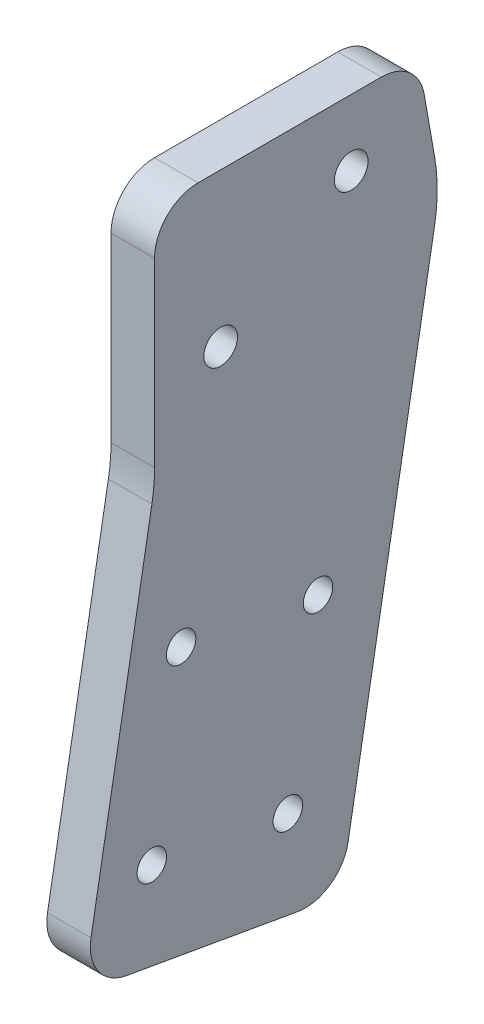
ISO-10303-21;
HEADER;
FILE_DESCRIPTION(('STEP AP214'),'2;1');
FILE_NAME('part.step','',(''),(''),'','','');
FILE_SCHEMA(('AUTOMOTIVE_DESIGN { 1 0 10303 214 1 1 1 1 }'));
ENDSEC;
DATA;
#1=APPLICATION_CONTEXT('core data for automotive mechanical design processes');
#2=APPLICATION_PROTOCOL_DEFINITION('international standard','automotive_design',2000,#1);
#3=PRODUCT_CONTEXT('',#1,'mechanical');
#4=PRODUCT('Part','Part','',(#3));
#5=PRODUCT_RELATED_PRODUCT_CATEGORY('part','',(#4));
#6=PRODUCT_DEFINITION_FORMATION('','',#4);
#7=PRODUCT_DEFINITION_CONTEXT('part definition',#1,'design');
#8=PRODUCT_DEFINITION('design','',#6,#7);
#9=PRODUCT_DEFINITION_SHAPE('','',#8);
#10=(LENGTH_UNIT() NAMED_UNIT(*) SI_UNIT(.MILLI.,.METRE.));
#11=(NAMED_UNIT(*) PLANE_ANGLE_UNIT() SI_UNIT($,.RADIAN.));
#12=(NAMED_UNIT(*) SI_UNIT($,.STERADIAN.) SOLID_ANGLE_UNIT());
#13=UNCERTAINTY_MEASURE_WITH_UNIT(LENGTH_MEASURE(1.E-05),#10,'distance_accuracy_value','');
#14=(GEOMETRIC_REPRESENTATION_CONTEXT(3) GLOBAL_UNCERTAINTY_ASSIGNED_CONTEXT((#13)) GLOBAL_UNIT_ASSIGNED_CONTEXT((#10,
#11,#12)) REPRESENTATION_CONTEXT('',''));
#15=CARTESIAN_POINT('',(0.,0.,0.));
#16=DIRECTION('',(0.,0.,1.));
#17=DIRECTION('',(1.,0.,0.));
#18=AXIS2_PLACEMENT_3D('',#15,#16,#17);
#19=CARTESIAN_POINT('',(-1.31417203510226,230.070458845019,-147.775624550014));
#20=DIRECTION('',(0.,0.984807753012208,-0.17364817766693));
#21=DIRECTION('',(0.,0.17364817766693,0.984807753012208));
#22=AXIS2_PLACEMENT_3D('',#19,#20,#21);
#23=PLANE('',#22);
#24=DIRECTION('',(0.,0.17364817766693,0.984807753012208));
#25=VECTOR('',#24,1.);
#26=CARTESIAN_POINT('',(5.03582796489774,230.070458845019,-147.775624550014));
#27=LINE('',#26,#25);
#28=CARTESIAN_POINT('',(5.03582796489774,231.173124773204,-141.522095318387));
#29=VERTEX_POINT('',#28);
#30=CARTESIAN_POINT('',(5.03582796489774,235.583788485944,-116.507978391878));
#31=VERTEX_POINT('',#30);
#32=EDGE_CURVE('E156',#29,#31,#27,.T.);
#33=ORIENTED_EDGE('',*,*,#32,.T.);
#34=DIRECTION('',(1.,0.,0.));
#35=VECTOR('',#34,1.);
#36=CARTESIAN_POINT('',(-1.31417203510226,235.583788485944,-116.507978391878));
#37=LINE('',#36,#35);
#38=CARTESIAN_POINT('',(-1.31417203510226,235.583788485944,-116.507978391878));
#39=VERTEX_POINT('',#38);
#40=EDGE_CURVE('E190',#31,#39,#37,.F.);
#41=ORIENTED_EDGE('',*,*,#40,.T.);
#42=DIRECTION('',(0.,0.17364817766693,0.984807753012208));
#43=VECTOR('',#42,1.);
#44=CARTESIAN_POINT('',(-1.31417203510226,230.070458845019,-147.775624550014));
#45=LINE('',#44,#43);
#46=CARTESIAN_POINT('',(-1.31417203510226,231.173124773204,-141.522095318387));
#47=VERTEX_POINT('',#46);
#48=EDGE_CURVE('E163',#47,#39,#45,.T.);
#49=ORIENTED_EDGE('',*,*,#48,.F.);
#50=DIRECTION('',(1.,0.,0.));
#51=VECTOR('',#50,1.);
#52=CARTESIAN_POINT('',(-1.31417203510226,231.173124773204,-141.522095318387));
#53=LINE('',#52,#51);
#54=EDGE_CURVE('E187',#47,#29,#53,.T.);
#55=ORIENTED_EDGE('',*,*,#54,.T.);
#56=EDGE_LOOP('',(#33,#41,#49,#55));
#57=FACE_BOUND('',#56,.T.);
#58=ADVANCED_FACE('F36',(#57),#23,.F.);
#59=CARTESIAN_POINT('',(-1.31417203510226,236.686454414129,-110.25444916025));
#60=DIRECTION('',(0.,-0.173648177666931,-0.984807753012208));
#61=DIRECTION('',(0.,0.984807753012208,-0.173648177666931));
#62=AXIS2_PLACEMENT_3D('',#59,#60,#61);
#63=PLANE('',#62);
#64=DIRECTION('',(0.,0.984807753012208,-0.173648177666931));
#65=VECTOR('',#64,1.);
#66=CARTESIAN_POINT('',(-1.31417203510226,236.686454414129,-110.25444916025));
#67=LINE('',#66,#65);
#68=CARTESIAN_POINT('',(-1.31417203510227,242.939983645756,-111.357115088435));
#69=VERTEX_POINT('',#68);
#70=CARTESIAN_POINT('',(-1.31417203510228,293.322725273824,-120.240951799527));
#71=VERTEX_POINT('',#70);
#72=EDGE_CURVE('E243',#69,#71,#67,.T.);
#73=ORIENTED_EDGE('',*,*,#72,.F.);
#74=DIRECTION('',(1.,0.,0.));
#75=VECTOR('',#74,1.);
#76=CARTESIAN_POINT('',(-1.31417203510227,242.939983645756,-111.357115088435));
#77=LINE('',#76,#75);
#78=CARTESIAN_POINT('',(5.03582796489773,242.939983645756,-111.357115088435));
#79=VERTEX_POINT('',#78);
#80=EDGE_CURVE('E177',#69,#79,#77,.T.);
#81=ORIENTED_EDGE('',*,*,#80,.T.);
#82=DIRECTION('',(0.,0.984807753012208,-0.173648177666931));
#83=VECTOR('',#82,1.);
#84=CARTESIAN_POINT('',(5.03582796489774,236.686454414129,-110.25444916025));
#85=LINE('',#84,#83);
#86=CARTESIAN_POINT('',(5.03582796489771,293.322725273824,-120.240951799527));
#87=VERTEX_POINT('',#86);
#88=EDGE_CURVE('E152',#79,#87,#85,.T.);
#89=ORIENTED_EDGE('',*,*,#88,.T.);
#90=DIRECTION('',(1.,0.,0.));
#91=VECTOR('',#90,1.);
#92=CARTESIAN_POINT('',(-1.31417203510228,293.322725273824,-120.240951799527));
#93=LINE('',#92,#91);
#94=EDGE_CURVE('E132',#87,#71,#93,.F.);
#95=ORIENTED_EDGE('',*,*,#94,.T.);
#96=EDGE_LOOP('',(#73,#81,#89,#95));
#97=FACE_BOUND('',#96,.T.);
#98=ADVANCED_FACE('F251',(#97),#63,.F.);
#99=CARTESIAN_POINT('',(-1.3141720351023,330.559017517181,-120.626834873017));
#100=DIRECTION('',(0.,0.,-1.));
#101=DIRECTION('',(-1.,0.,0.));
#102=AXIS2_PLACEMENT_3D('',#99,#100,#101);
#103=PLANE('',#102);
#104=DIRECTION('',(0.,1.,0.));
#105=VECTOR('',#104,1.);
#106=CARTESIAN_POINT('',(5.0358279648977,330.559017517181,-120.626834873017));
#107=LINE('',#106,#105);
#108=CARTESIAN_POINT('',(5.03582796489771,297.733388986564,-120.626834873017));
#109=VERTEX_POINT('',#108);
#110=CARTESIAN_POINT('',(5.0358279648977,324.209017517181,-120.626834873017));
#111=VERTEX_POINT('',#110);
#112=EDGE_CURVE('E143',#109,#111,#107,.T.);
#113=ORIENTED_EDGE('',*,*,#112,.T.);
#114=DIRECTION('',(1.,0.,0.));
#115=VECTOR('',#114,1.);
#116=CARTESIAN_POINT('',(-1.3141720351023,324.209017517181,-120.626834873017));
#117=LINE('',#116,#115);
#118=CARTESIAN_POINT('',(-1.3141720351023,324.209017517181,-120.626834873017));
#119=VERTEX_POINT('',#118);
#120=EDGE_CURVE('E11',#111,#119,#117,.F.);
#121=ORIENTED_EDGE('',*,*,#120,.T.);
#122=DIRECTION('',(0.,1.,0.));
#123=VECTOR('',#122,1.);
#124=CARTESIAN_POINT('',(-1.3141720351023,330.559017517181,-120.626834873017));
#125=LINE('',#124,#123);
#126=CARTESIAN_POINT('',(-1.31417203510229,297.733388986564,-120.626834873017));
#127=VERTEX_POINT('',#126);
#128=EDGE_CURVE('E145',#127,#119,#125,.T.);
#129=ORIENTED_EDGE('',*,*,#128,.F.);
#130=DIRECTION('',(1.,0.,0.));
#131=VECTOR('',#130,1.);
#132=CARTESIAN_POINT('',(5.03582796489771,297.733388986564,-120.626834873017));
#133=LINE('',#132,#131);
#134=EDGE_CURVE('E130',#127,#109,#133,.T.);
#135=ORIENTED_EDGE('',*,*,#134,.T.);
#136=EDGE_LOOP('',(#113,#121,#129,#135));
#137=FACE_BOUND('',#136,.T.);
#138=ADVANCED_FACE('F142',(#137),#103,.F.);
#139=CARTESIAN_POINT('',(-1.3141720351023,330.559017517181,-159.045133050029));
#140=DIRECTION('',(0.,-1.,0.));
#141=DIRECTION('',(1.,0.,0.));
#142=AXIS2_PLACEMENT_3D('',#139,#140,#141);
#143=PLANE('',#142);
#144=DIRECTION('',(0.,0.,-1.));
#145=VECTOR('',#144,1.);
#146=CARTESIAN_POINT('',(5.0358279648977,330.559017517181,-159.045133050029));
#147=LINE('',#146,#145);
#148=CARTESIAN_POINT('',(5.0358279648977,330.559017517181,-126.976834873017));
#149=VERTEX_POINT('',#148);
#150=CARTESIAN_POINT('',(5.0358279648977,330.559017517181,-153.716850392054));
#151=VERTEX_POINT('',#150);
#152=EDGE_CURVE('E151',#149,#151,#147,.T.);
#153=ORIENTED_EDGE('',*,*,#152,.T.);
#154=DIRECTION('',(1.,0.,0.));
#155=VECTOR('',#154,1.);
#156=CARTESIAN_POINT('',(-1.3141720351023,330.559017517181,-153.716850392054));
#157=LINE('',#156,#155);
#158=CARTESIAN_POINT('',(-1.3141720351023,330.559017517181,-153.716850392054));
#159=VERTEX_POINT('',#158);
#160=EDGE_CURVE('E44',#151,#159,#157,.F.);
#161=ORIENTED_EDGE('',*,*,#160,.T.);
#162=DIRECTION('',(0.,0.,-1.));
#163=VECTOR('',#162,1.);
#164=CARTESIAN_POINT('',(-1.3141720351023,330.559017517181,-159.045133050029));
#165=LINE('',#164,#163);
#166=CARTESIAN_POINT('',(-1.3141720351023,330.559017517181,-126.976834873017));
#167=VERTEX_POINT('',#166);
#168=EDGE_CURVE('E208',#167,#159,#165,.T.);
#169=ORIENTED_EDGE('',*,*,#168,.F.);
#170=DIRECTION('',(1.,0.,0.));
#171=VECTOR('',#170,1.);
#172=CARTESIAN_POINT('',(-1.3141720351023,330.559017517181,-126.976834873017));
#173=LINE('',#172,#171);
#174=EDGE_CURVE('E204',#167,#149,#173,.T.);
#175=ORIENTED_EDGE('',*,*,#174,.T.);
#176=EDGE_LOOP('',(#153,#161,#169,#175));
#177=FACE_BOUND('',#176,.T.);
#178=ADVANCED_FACE('F207',(#177),#143,.F.);
#179=CARTESIAN_POINT('',(-1.31417203510229,312.271017517181,-162.269800873226));
#180=DIRECTION('',(0.,-0.173648177666927,0.984807753012209));
#181=DIRECTION('',(0.,-0.984807753012209,-0.173648177666927));
#182=AXIS2_PLACEMENT_3D('',#179,#180,#181);
#183=PLANE('',#182);
#184=DIRECTION('',(0.,-0.984807753012209,-0.173648177666927));
#185=VECTOR('',#184,1.);
#186=CARTESIAN_POINT('',(-1.31417203510229,312.271017517181,-162.269800873226));
#187=LINE('',#186,#185);
#188=CARTESIAN_POINT('',(-1.3141720351023,325.311683445366,-159.970379623681));
#189=VERTEX_POINT('',#188);
#190=CARTESIAN_POINT('',(-1.3141720351023,316.681681229921,-161.492081857838));
#191=VERTEX_POINT('',#190);
#192=EDGE_CURVE('E218',#189,#191,#187,.T.);
#193=ORIENTED_EDGE('',*,*,#192,.F.);
#194=DIRECTION('',(1.,0.,0.));
#195=VECTOR('',#194,1.);
#196=CARTESIAN_POINT('',(-1.3141720351023,325.311683445366,-159.970379623681));
#197=LINE('',#196,#195);
#198=CARTESIAN_POINT('',(5.0358279648977,325.311683445366,-159.970379623681));
#199=VERTEX_POINT('',#198);
#200=EDGE_CURVE('E201',#189,#199,#197,.T.);
#201=ORIENTED_EDGE('',*,*,#200,.T.);
#202=DIRECTION('',(0.,-0.984807753012209,-0.173648177666927));
#203=VECTOR('',#202,1.);
#204=CARTESIAN_POINT('',(5.03582796489771,312.271017517181,-162.269800873226));
#205=LINE('',#204,#203);
#206=CARTESIAN_POINT('',(5.0358279648977,316.681681229921,-161.492081857838));
#207=VERTEX_POINT('',#206);
#208=EDGE_CURVE('E154',#199,#207,#205,.T.);
#209=ORIENTED_EDGE('',*,*,#208,.T.);
#210=DIRECTION('',(1.,0.,0.));
#211=VECTOR('',#210,1.);
#212=CARTESIAN_POINT('',(-1.3141720351023,316.681681229921,-161.492081857838));
#213=LINE('',#212,#211);
#214=EDGE_CURVE('E172',#207,#191,#213,.F.);
#215=ORIENTED_EDGE('',*,*,#214,.T.);
#216=EDGE_LOOP('',(#193,#201,#209,#215));
#217=FACE_BOUND('',#216,.T.);
#218=ADVANCED_FACE('F217',(#217),#183,.F.);
#219=CARTESIAN_POINT('',(-1.31417203510226,230.070458845019,-147.775624550014));
#220=DIRECTION('',(0.,0.173648177666931,0.984807753012208));
#221=DIRECTION('',(0.,-0.984807753012208,0.173648177666931));
#222=AXIS2_PLACEMENT_3D('',#219,#220,#221);
#223=PLANE('',#222);
#224=DIRECTION('',(0.,-0.984807753012208,0.173648177666931));
#225=VECTOR('',#224,1.);
#226=CARTESIAN_POINT('',(5.03582796489774,230.070458845019,-147.775624550014));
#227=LINE('',#226,#225);
#228=CARTESIAN_POINT('',(5.03582796489771,307.860353804441,-161.492081857838));
#229=VERTEX_POINT('',#228);
#230=CARTESIAN_POINT('',(5.03582796489773,236.323988076647,-148.878290478199));
#231=VERTEX_POINT('',#230);
#232=EDGE_CURVE('E161',#229,#231,#227,.T.);
#233=ORIENTED_EDGE('',*,*,#232,.T.);
#234=DIRECTION('',(1.,0.,0.));
#235=VECTOR('',#234,1.);
#236=CARTESIAN_POINT('',(-1.31417203510227,236.323988076647,-148.878290478199));
#237=LINE('',#236,#235);
#238=CARTESIAN_POINT('',(-1.31417203510227,236.323988076647,-148.878290478199));
#239=VERTEX_POINT('',#238);
#240=EDGE_CURVE('E199',#231,#239,#237,.F.);
#241=ORIENTED_EDGE('',*,*,#240,.T.);
#242=DIRECTION('',(0.,-0.984807753012208,0.173648177666931));
#243=VECTOR('',#242,1.);
#244=CARTESIAN_POINT('',(-1.31417203510226,230.070458845019,-147.775624550014));
#245=LINE('',#244,#243);
#246=CARTESIAN_POINT('',(-1.31417203510229,307.860353804441,-161.492081857838));
#247=VERTEX_POINT('',#246);
#248=EDGE_CURVE('E146',#247,#239,#245,.T.);
#249=ORIENTED_EDGE('',*,*,#248,.F.);
#250=DIRECTION('',(1.,0.,0.));
#251=VECTOR('',#250,1.);
#252=CARTESIAN_POINT('',(-1.31417203510229,307.860353804441,-161.492081857838));
#253=LINE('',#252,#251);
#254=EDGE_CURVE('E166',#247,#229,#253,.T.);
#255=ORIENTED_EDGE('',*,*,#254,.T.);
#256=EDGE_LOOP('',(#233,#241,#249,#255));
#257=FACE_BOUND('',#256,.T.);
#258=ADVANCED_FACE('F286',(#257),#223,.F.);
#259=CARTESIAN_POINT('',(-1.31417203510217,0.,0.));
#260=DIRECTION('',(-1.,0.,0.));
#261=DIRECTION('',(0.,-1.,0.));
#262=AXIS2_PLACEMENT_3D('',#259,#260,#261);
#263=PLANE('',#262);
#264=CARTESIAN_POINT('',(-1.3141720351023,320.907017517181,-149.328834873017));
#265=DIRECTION('',(-1.,0.,0.));
#266=DIRECTION('',(0.,0.,1.));
#267=AXIS2_PLACEMENT_3D('',#264,#265,#266);
#268=CIRCLE('',#267,4.21640000000001);
#269=CARTESIAN_POINT('',(-1.3141720351023,320.907017517181,-145.112434873017));
#270=VERTEX_POINT('',#269);
#271=EDGE_CURVE('E570',#270,#270,#268,.T.);
#272=ORIENTED_EDGE('',*,*,#271,.F.);
#273=EDGE_LOOP('',(#272));
#274=FACE_BOUND('',#273,.T.);
#275=CARTESIAN_POINT('',(-1.31417203510229,308.207017517181,-130.278834873017));
#276=DIRECTION('',(-1.,0.,0.));
#277=DIRECTION('',(0.,0.,1.));
#278=AXIS2_PLACEMENT_3D('',#275,#276,#277);
#279=CIRCLE('',#278,4.21640000000001);
#280=CARTESIAN_POINT('',(-1.31417203510229,308.207017517181,-126.062434873017));
#281=VERTEX_POINT('',#280);
#282=EDGE_CURVE('E561',#281,#281,#279,.T.);
#283=ORIENTED_EDGE('',*,*,#282,.F.);
#284=EDGE_LOOP('',(#283));
#285=FACE_BOUND('',#284,.T.);
#286=CARTESIAN_POINT('',(-1.31417203510228,273.13941545584,-124.504125042983));
#287=DIRECTION('',(-1.,0.,0.));
#288=DIRECTION('',(0.,0.,1.));
#289=AXIS2_PLACEMENT_3D('',#286,#287,#288);
#290=CIRCLE('',#289,3.54329999999997);
#291=CARTESIAN_POINT('',(-1.31417203510228,273.13941545584,-120.960825042983));
#292=VERTEX_POINT('',#291);
#293=EDGE_CURVE('E552',#292,#292,#290,.T.);
#294=ORIENTED_EDGE('',*,*,#293,.F.);
#295=EDGE_LOOP('',(#294));
#296=FACE_BOUND('',#295,.T.);
#297=CARTESIAN_POINT('',(-1.31417203510228,269.72417914843,-144.485224024571));
#298=DIRECTION('',(-1.,0.,0.));
#299=DIRECTION('',(0.,0.,1.));
#300=AXIS2_PLACEMENT_3D('',#297,#298,#299);
#301=CIRCLE('',#300,3.54329999999997);
#302=CARTESIAN_POINT('',(-1.31417203510228,269.72417914843,-140.941924024571));
#303=VERTEX_POINT('',#302);
#304=EDGE_CURVE('E543',#303,#303,#301,.T.);
#305=ORIENTED_EDGE('',*,*,#304,.F.);
#306=EDGE_LOOP('',(#305));
#307=FACE_BOUND('',#306,.T.);
#308=CARTESIAN_POINT('',(-1.31417203510227,244.32417914843,-140.075144867288));
#309=DIRECTION('',(-1.,0.,0.));
#310=DIRECTION('',(0.,0.,1.));
#311=AXIS2_PLACEMENT_3D('',#308,#309,#310);
#312=CIRCLE('',#311,3.5433);
#313=CARTESIAN_POINT('',(-1.31417203510227,244.32417914843,-136.531844867288));
#314=VERTEX_POINT('',#313);
#315=EDGE_CURVE('E534',#314,#314,#312,.T.);
#316=ORIENTED_EDGE('',*,*,#315,.F.);
#317=EDGE_LOOP('',(#316));
#318=FACE_BOUND('',#317,.T.);
#319=CARTESIAN_POINT('',(-1.31417203510227,247.716621745922,-120.227402213944));
#320=DIRECTION('',(-1.,0.,0.));
#321=DIRECTION('',(0.,0.,1.));
#322=AXIS2_PLACEMENT_3D('',#319,#320,#321);
#323=CIRCLE('',#322,3.54330000000003);
#324=CARTESIAN_POINT('',(-1.31417203510227,247.716621745922,-116.684102213944));
#325=VERTEX_POINT('',#324);
#326=EDGE_CURVE('E237',#325,#325,#323,.T.);
#327=ORIENTED_EDGE('',*,*,#326,.F.);
#328=EDGE_LOOP('',(#327));
#329=FACE_BOUND('',#328,.T.);
#330=ORIENTED_EDGE('',*,*,#48,.T.);
#331=CARTESIAN_POINT('',(-1.31417203510227,241.837317717571,-117.610644320063));
#332=DIRECTION('',(-1.,0.,0.));
#333=DIRECTION('',(0.,-1.,0.));
#334=AXIS2_PLACEMENT_3D('',#331,#332,#333);
#335=CIRCLE('',#334,6.35);
#336=EDGE_CURVE('E197',#39,#69,#335,.T.);
#337=ORIENTED_EDGE('',*,*,#336,.T.);
#338=ORIENTED_EDGE('',*,*,#72,.T.);
#339=CARTESIAN_POINT('',(-1.31417203510229,297.733388986564,-95.2268348730171));
#340=DIRECTION('',(-1.,0.,0.));
#341=DIRECTION('',(0.,-1.,0.));
#342=AXIS2_PLACEMENT_3D('',#339,#340,#341);
#343=CIRCLE('',#342,25.4);
#344=EDGE_CURVE('E136',#71,#127,#343,.F.);
#345=ORIENTED_EDGE('',*,*,#344,.T.);
#346=ORIENTED_EDGE('',*,*,#128,.T.);
#347=CARTESIAN_POINT('',(-1.3141720351023,324.209017517181,-126.976834873017));
#348=DIRECTION('',(-1.,0.,0.));
#349=DIRECTION('',(0.,-1.,0.));
#350=AXIS2_PLACEMENT_3D('',#347,#348,#349);
#351=CIRCLE('',#350,6.35);
#352=EDGE_CURVE('E57',#119,#167,#351,.T.);
#353=ORIENTED_EDGE('',*,*,#352,.T.);
#354=ORIENTED_EDGE('',*,*,#168,.T.);
#355=CARTESIAN_POINT('',(-1.3141720351023,324.209017517181,-153.716850392054));
#356=DIRECTION('',(-1.,0.,0.));
#357=DIRECTION('',(0.,-1.,0.));
#358=AXIS2_PLACEMENT_3D('',#355,#356,#357);
#359=CIRCLE('',#358,6.35);
#360=EDGE_CURVE('E193',#159,#189,#359,.T.);
#361=ORIENTED_EDGE('',*,*,#360,.T.);
#362=ORIENTED_EDGE('',*,*,#192,.T.);
#363=CARTESIAN_POINT('',(-1.31417203510229,312.271017517181,-136.477964931328));
#364=DIRECTION('',(-1.,0.,0.));
#365=DIRECTION('',(0.,-1.,0.));
#366=AXIS2_PLACEMENT_3D('',#363,#364,#365);
#367=CIRCLE('',#366,25.4);
#368=EDGE_CURVE('E137',#191,#247,#367,.T.);
#369=ORIENTED_EDGE('',*,*,#368,.T.);
#370=ORIENTED_EDGE('',*,*,#248,.T.);
#371=CARTESIAN_POINT('',(-1.31417203510227,237.426654004832,-142.624761246572));
#372=DIRECTION('',(-1.,0.,0.));
#373=DIRECTION('',(0.,-1.,0.));
#374=AXIS2_PLACEMENT_3D('',#371,#372,#373);
#375=CIRCLE('',#374,6.35);
#376=EDGE_CURVE('E195',#239,#47,#375,.T.);
#377=ORIENTED_EDGE('',*,*,#376,.T.);
#378=EDGE_LOOP('',(#330,#337,#338,#345,#346,#353,#354,#361,#362,#369,#370,#377));
#379=FACE_BOUND('',#378,.T.);
#380=ADVANCED_FACE('F244',(#274,#285,#296,#307,#318,#329,#379),#263,.T.);
#381=CARTESIAN_POINT('',(5.03582796489783,0.,0.));
#382=DIRECTION('',(-1.,0.,0.));
#383=DIRECTION('',(0.,-1.,0.));
#384=AXIS2_PLACEMENT_3D('',#381,#382,#383);
#385=PLANE('',#384);
#386=CARTESIAN_POINT('',(5.03582796489777,320.907017517181,-149.328834873017));
#387=DIRECTION('',(-1.,0.,0.));
#388=DIRECTION('',(0.,0.,1.));
#389=AXIS2_PLACEMENT_3D('',#386,#387,#388);
#390=CIRCLE('',#389,2.45744999999997);
#391=CARTESIAN_POINT('',(5.03582796489777,320.907017517181,-146.871384873017));
#392=VERTEX_POINT('',#391);
#393=EDGE_CURVE('E564',#392,#392,#390,.T.);
#394=ORIENTED_EDGE('',*,*,#393,.T.);
#395=EDGE_LOOP('',(#394));
#396=FACE_BOUND('',#395,.T.);
#397=CARTESIAN_POINT('',(5.03582796489778,308.207017517181,-130.278834873017));
#398=DIRECTION('',(-1.,0.,0.));
#399=DIRECTION('',(0.,0.,1.));
#400=AXIS2_PLACEMENT_3D('',#397,#398,#399);
#401=CIRCLE('',#400,2.45744999999997);
#402=CARTESIAN_POINT('',(5.03582796489778,308.207017517181,-127.821384873017));
#403=VERTEX_POINT('',#402);
#404=EDGE_CURVE('E555',#403,#403,#401,.T.);
#405=ORIENTED_EDGE('',*,*,#404,.T.);
#406=EDGE_LOOP('',(#405));
#407=FACE_BOUND('',#406,.T.);
#408=CARTESIAN_POINT('',(5.03582796489776,273.13941545584,-124.504125042983));
#409=DIRECTION('',(-1.,0.,0.));
#410=DIRECTION('',(0.,0.,1.));
#411=AXIS2_PLACEMENT_3D('',#408,#409,#410);
#412=CIRCLE('',#411,2.15264999999998);
#413=CARTESIAN_POINT('',(5.03582796489776,273.13941545584,-122.351475042983));
#414=VERTEX_POINT('',#413);
#415=EDGE_CURVE('E546',#414,#414,#412,.T.);
#416=ORIENTED_EDGE('',*,*,#415,.T.);
#417=EDGE_LOOP('',(#416));
#418=FACE_BOUND('',#417,.T.);
#419=CARTESIAN_POINT('',(5.03582796489776,269.72417914843,-144.485224024571));
#420=DIRECTION('',(-1.,0.,0.));
#421=DIRECTION('',(0.,0.,1.));
#422=AXIS2_PLACEMENT_3D('',#419,#420,#421);
#423=CIRCLE('',#422,2.15264999999998);
#424=CARTESIAN_POINT('',(5.03582796489776,269.72417914843,-142.332574024571));
#425=VERTEX_POINT('',#424);
#426=EDGE_CURVE('E537',#425,#425,#423,.T.);
#427=ORIENTED_EDGE('',*,*,#426,.T.);
#428=EDGE_LOOP('',(#427));
#429=FACE_BOUND('',#428,.T.);
#430=CARTESIAN_POINT('',(5.03582796489777,244.32417914843,-140.075144867288));
#431=DIRECTION('',(-1.,0.,0.));
#432=DIRECTION('',(0.,0.,1.));
#433=AXIS2_PLACEMENT_3D('',#430,#431,#432);
#434=CIRCLE('',#433,2.15265000000001);
#435=CARTESIAN_POINT('',(5.03582796489777,244.32417914843,-137.922494867288));
#436=VERTEX_POINT('',#435);
#437=EDGE_CURVE('E527',#436,#436,#434,.T.);
#438=ORIENTED_EDGE('',*,*,#437,.T.);
#439=EDGE_LOOP('',(#438));
#440=FACE_BOUND('',#439,.T.);
#441=CARTESIAN_POINT('',(5.03582796489777,247.716621745922,-120.227402213944));
#442=DIRECTION('',(-1.,0.,0.));
#443=DIRECTION('',(0.,0.,1.));
#444=AXIS2_PLACEMENT_3D('',#441,#442,#443);
#445=CIRCLE('',#444,2.15265000000001);
#446=CARTESIAN_POINT('',(5.03582796489777,247.716621745922,-118.074752213944));
#447=VERTEX_POINT('',#446);
#448=EDGE_CURVE('E227',#447,#447,#445,.T.);
#449=ORIENTED_EDGE('',*,*,#448,.T.);
#450=EDGE_LOOP('',(#449));
#451=FACE_BOUND('',#450,.T.);
#452=ORIENTED_EDGE('',*,*,#88,.F.);
#453=CARTESIAN_POINT('',(5.03582796489773,241.837317717571,-117.610644320063));
#454=DIRECTION('',(-1.,0.,0.));
#455=DIRECTION('',(0.,-1.,0.));
#456=AXIS2_PLACEMENT_3D('',#453,#454,#455);
#457=CIRCLE('',#456,6.35);
#458=EDGE_CURVE('E185',#79,#31,#457,.F.);
#459=ORIENTED_EDGE('',*,*,#458,.T.);
#460=ORIENTED_EDGE('',*,*,#32,.F.);
#461=CARTESIAN_POINT('',(5.03582796489773,237.426654004832,-142.624761246572));
#462=DIRECTION('',(-1.,0.,0.));
#463=DIRECTION('',(0.,-1.,0.));
#464=AXIS2_PLACEMENT_3D('',#461,#462,#463);
#465=CIRCLE('',#464,6.35);
#466=EDGE_CURVE('E183',#29,#231,#465,.F.);
#467=ORIENTED_EDGE('',*,*,#466,.T.);
#468=ORIENTED_EDGE('',*,*,#232,.F.);
#469=CARTESIAN_POINT('',(5.03582796489771,312.271017517181,-136.477964931328));
#470=DIRECTION('',(-1.,0.,0.));
#471=DIRECTION('',(0.,-1.,0.));
#472=AXIS2_PLACEMENT_3D('',#469,#470,#471);
#473=CIRCLE('',#472,25.4);
#474=EDGE_CURVE('E169',#229,#207,#473,.F.);
#475=ORIENTED_EDGE('',*,*,#474,.T.);
#476=ORIENTED_EDGE('',*,*,#208,.F.);
#477=CARTESIAN_POINT('',(5.0358279648977,324.209017517181,-153.716850392054));
#478=DIRECTION('',(-1.,0.,0.));
#479=DIRECTION('',(0.,-1.,0.));
#480=AXIS2_PLACEMENT_3D('',#477,#478,#479);
#481=CIRCLE('',#480,6.35);
#482=EDGE_CURVE('E181',#199,#151,#481,.F.);
#483=ORIENTED_EDGE('',*,*,#482,.T.);
#484=ORIENTED_EDGE('',*,*,#152,.F.);
#485=CARTESIAN_POINT('',(5.0358279648977,324.209017517181,-126.976834873017));
#486=DIRECTION('',(-1.,0.,0.));
#487=DIRECTION('',(0.,-1.,0.));
#488=AXIS2_PLACEMENT_3D('',#485,#486,#487);
#489=CIRCLE('',#488,6.35);
#490=EDGE_CURVE('E150',#149,#111,#489,.F.);
#491=ORIENTED_EDGE('',*,*,#490,.T.);
#492=ORIENTED_EDGE('',*,*,#112,.F.);
#493=CARTESIAN_POINT('',(5.03582796489771,297.733388986564,-95.2268348730171));
#494=DIRECTION('',(-1.,0.,0.));
#495=DIRECTION('',(0.,-1.,0.));
#496=AXIS2_PLACEMENT_3D('',#493,#494,#495);
#497=CIRCLE('',#496,25.4);
#498=EDGE_CURVE('E126',#109,#87,#497,.T.);
#499=ORIENTED_EDGE('',*,*,#498,.T.);
#500=EDGE_LOOP('',(#452,#459,#460,#467,#468,#475,#476,#483,#484,#491,#492,#499));
#501=FACE_BOUND('',#500,.T.);
#502=ADVANCED_FACE('F148',(#396,#407,#418,#429,#440,#451,#501),#385,.F.);
#503=CARTESIAN_POINT('',(-1.31417203510228,297.733388986564,-95.2268348730171));
#504=DIRECTION('',(-1.,0.,0.));
#505=DIRECTION('',(0.,-1.,0.));
#506=AXIS2_PLACEMENT_3D('',#503,#504,#505);
#507=CYLINDRICAL_SURFACE('',#506,25.4);
#508=ORIENTED_EDGE('',*,*,#344,.F.);
#509=ORIENTED_EDGE('',*,*,#94,.F.);
#510=ORIENTED_EDGE('',*,*,#498,.F.);
#511=ORIENTED_EDGE('',*,*,#134,.F.);
#512=EDGE_LOOP('',(#508,#509,#510,#511));
#513=FACE_BOUND('',#512,.T.);
#514=ADVANCED_FACE('F129',(#513),#507,.F.);
#515=CARTESIAN_POINT('',(-1.31417203510229,312.271017517181,-136.477964931328));
#516=DIRECTION('',(1.,0.,0.));
#517=DIRECTION('',(0.,1.,0.));
#518=AXIS2_PLACEMENT_3D('',#515,#516,#517);
#519=CYLINDRICAL_SURFACE('',#518,25.4);
#520=ORIENTED_EDGE('',*,*,#368,.F.);
#521=ORIENTED_EDGE('',*,*,#214,.F.);
#522=ORIENTED_EDGE('',*,*,#474,.F.);
#523=ORIENTED_EDGE('',*,*,#254,.F.);
#524=EDGE_LOOP('',(#520,#521,#522,#523));
#525=FACE_BOUND('',#524,.T.);
#526=ADVANCED_FACE('F262',(#525),#519,.T.);
#527=CARTESIAN_POINT('',(-1.31417203510227,247.716621745922,-120.227402213944));
#528=DIRECTION('',(-1.,0.,0.));
#529=DIRECTION('',(0.,0.,1.));
#530=AXIS2_PLACEMENT_3D('',#527,#528,#529);
#531=CYLINDRICAL_SURFACE('',#530,2.15264999999999);
#532=ORIENTED_EDGE('',*,*,#448,.F.);
#533=EDGE_LOOP('',(#532));
#534=FACE_BOUND('',#533,.T.);
#535=CARTESIAN_POINT('',(-0.147278133005591,247.716621745922,-120.227402213944));
#536=DIRECTION('',(-1.,0.,0.));
#537=DIRECTION('',(0.,0.,1.));
#538=AXIS2_PLACEMENT_3D('',#535,#536,#537);
#539=CIRCLE('',#538,2.15264999999998);
#540=CARTESIAN_POINT('',(-0.147278133005591,247.716621745922,-118.074752213944));
#541=VERTEX_POINT('',#540);
#542=EDGE_CURVE('E232',#541,#541,#539,.T.);
#543=ORIENTED_EDGE('',*,*,#542,.T.);
#544=EDGE_LOOP('',(#543));
#545=FACE_BOUND('',#544,.T.);
#546=ADVANCED_FACE('F265',(#534,#545),#531,.F.);
#547=CARTESIAN_POINT('',(-1.31417203510227,247.716621745922,-120.227402213944));
#548=DIRECTION('',(-1.,0.,0.));
#549=DIRECTION('',(0.,0.,1.));
#550=AXIS2_PLACEMENT_3D('',#547,#548,#549);
#551=CONICAL_SURFACE('',#550,3.54330000000003,0.872664625997184);
#552=ORIENTED_EDGE('',*,*,#542,.F.);
#553=EDGE_LOOP('',(#552));
#554=FACE_BOUND('',#553,.T.);
#555=ORIENTED_EDGE('',*,*,#326,.T.);
#556=EDGE_LOOP('',(#555));
#557=FACE_BOUND('',#556,.T.);
#558=ADVANCED_FACE('F425',(#554,#557),#551,.F.);
#559=CARTESIAN_POINT('',(-1.31417203510227,244.32417914843,-140.075144867288));
#560=DIRECTION('',(-1.,0.,0.));
#561=DIRECTION('',(0.,0.,1.));
#562=AXIS2_PLACEMENT_3D('',#559,#560,#561);
#563=CYLINDRICAL_SURFACE('',#562,2.15264999999999);
#564=ORIENTED_EDGE('',*,*,#437,.F.);
#565=EDGE_LOOP('',(#564));
#566=FACE_BOUND('',#565,.T.);
#567=CARTESIAN_POINT('',(-0.147278133005591,244.32417914843,-140.075144867288));
#568=DIRECTION('',(-1.,0.,0.));
#569=DIRECTION('',(0.,0.,1.));
#570=AXIS2_PLACEMENT_3D('',#567,#568,#569);
#571=CIRCLE('',#570,2.15264999999998);
#572=CARTESIAN_POINT('',(-0.147278133005591,244.32417914843,-137.922494867288));
#573=VERTEX_POINT('',#572);
#574=EDGE_CURVE('E529',#573,#573,#571,.T.);
#575=ORIENTED_EDGE('',*,*,#574,.T.);
#576=EDGE_LOOP('',(#575));
#577=FACE_BOUND('',#576,.T.);
#578=ADVANCED_FACE('F418',(#566,#577),#563,.F.);
#579=CARTESIAN_POINT('',(-1.31417203510227,244.32417914843,-140.075144867288));
#580=DIRECTION('',(-1.,0.,0.));
#581=DIRECTION('',(0.,0.,1.));
#582=AXIS2_PLACEMENT_3D('',#579,#580,#581);
#583=CONICAL_SURFACE('',#582,3.5433,0.872664625997175);
#584=ORIENTED_EDGE('',*,*,#574,.F.);
#585=EDGE_LOOP('',(#584));
#586=FACE_BOUND('',#585,.T.);
#587=ORIENTED_EDGE('',*,*,#315,.T.);
#588=EDGE_LOOP('',(#587));
#589=FACE_BOUND('',#588,.T.);
#590=ADVANCED_FACE('F411',(#586,#589),#583,.F.);
#591=CARTESIAN_POINT('',(-1.31417203510228,269.72417914843,-144.485224024571));
#592=DIRECTION('',(-1.,0.,0.));
#593=DIRECTION('',(0.,0.,1.));
#594=AXIS2_PLACEMENT_3D('',#591,#592,#593);
#595=CYLINDRICAL_SURFACE('',#594,2.15264999999998);
#596=ORIENTED_EDGE('',*,*,#426,.F.);
#597=EDGE_LOOP('',(#596));
#598=FACE_BOUND('',#597,.T.);
#599=CARTESIAN_POINT('',(-0.1472781330056,269.72417914843,-144.485224024571));
#600=DIRECTION('',(-1.,0.,0.));
#601=DIRECTION('',(0.,0.,1.));
#602=AXIS2_PLACEMENT_3D('',#599,#600,#601);
#603=CIRCLE('',#602,2.15264999999998);
#604=CARTESIAN_POINT('',(-0.1472781330056,269.72417914843,-142.332574024571));
#605=VERTEX_POINT('',#604);
#606=EDGE_CURVE('E540',#605,#605,#603,.T.);
#607=ORIENTED_EDGE('',*,*,#606,.T.);
#608=EDGE_LOOP('',(#607));
#609=FACE_BOUND('',#608,.T.);
#610=ADVANCED_FACE('F404',(#598,#609),#595,.F.);
#611=CARTESIAN_POINT('',(-1.31417203510228,269.72417914843,-144.485224024571));
#612=DIRECTION('',(-1.,0.,0.));
#613=DIRECTION('',(0.,0.,1.));
#614=AXIS2_PLACEMENT_3D('',#611,#612,#613);
#615=CONICAL_SURFACE('',#614,3.54329999999997,0.872664625997165);
#616=ORIENTED_EDGE('',*,*,#606,.F.);
#617=EDGE_LOOP('',(#616));
#618=FACE_BOUND('',#617,.T.);
#619=ORIENTED_EDGE('',*,*,#304,.T.);
#620=EDGE_LOOP('',(#619));
#621=FACE_BOUND('',#620,.T.);
#622=ADVANCED_FACE('F397',(#618,#621),#615,.F.);
#623=CARTESIAN_POINT('',(-1.31417203510228,273.13941545584,-124.504125042983));
#624=DIRECTION('',(-1.,0.,0.));
#625=DIRECTION('',(0.,0.,1.));
#626=AXIS2_PLACEMENT_3D('',#623,#624,#625);
#627=CYLINDRICAL_SURFACE('',#626,2.15264999999998);
#628=ORIENTED_EDGE('',*,*,#415,.F.);
#629=EDGE_LOOP('',(#628));
#630=FACE_BOUND('',#629,.T.);
#631=CARTESIAN_POINT('',(-0.1472781330056,273.13941545584,-124.504125042983));
#632=DIRECTION('',(-1.,0.,0.));
#633=DIRECTION('',(0.,0.,1.));
#634=AXIS2_PLACEMENT_3D('',#631,#632,#633);
#635=CIRCLE('',#634,2.15264999999998);
#636=CARTESIAN_POINT('',(-0.1472781330056,273.13941545584,-122.351475042983));
#637=VERTEX_POINT('',#636);
#638=EDGE_CURVE('E549',#637,#637,#635,.T.);
#639=ORIENTED_EDGE('',*,*,#638,.T.);
#640=EDGE_LOOP('',(#639));
#641=FACE_BOUND('',#640,.T.);
#642=ADVANCED_FACE('F389',(#630,#641),#627,.F.);
#643=CARTESIAN_POINT('',(-1.31417203510228,273.13941545584,-124.504125042983));
#644=DIRECTION('',(-1.,0.,0.));
#645=DIRECTION('',(0.,0.,1.));
#646=AXIS2_PLACEMENT_3D('',#643,#644,#645);
#647=CONICAL_SURFACE('',#646,3.54329999999997,0.872664625997165);
#648=ORIENTED_EDGE('',*,*,#638,.F.);
#649=EDGE_LOOP('',(#648));
#650=FACE_BOUND('',#649,.T.);
#651=ORIENTED_EDGE('',*,*,#293,.T.);
#652=EDGE_LOOP('',(#651));
#653=FACE_BOUND('',#652,.T.);
#654=ADVANCED_FACE('F383',(#650,#653),#647,.F.);
#655=CARTESIAN_POINT('',(-1.31417203510229,308.207017517181,-130.278834873017));
#656=DIRECTION('',(-1.,0.,0.));
#657=DIRECTION('',(0.,0.,1.));
#658=AXIS2_PLACEMENT_3D('',#655,#656,#657);
#659=CYLINDRICAL_SURFACE('',#658,2.45744999999997);
#660=ORIENTED_EDGE('',*,*,#404,.F.);
#661=EDGE_LOOP('',(#660));
#662=FACE_BOUND('',#661,.T.);
#663=CARTESIAN_POINT('',(0.161762261156988,308.207017517181,-130.278834873017));
#664=DIRECTION('',(-1.,0.,0.));
#665=DIRECTION('',(0.,0.,1.));
#666=AXIS2_PLACEMENT_3D('',#663,#664,#665);
#667=CIRCLE('',#666,2.45744999999997);
#668=CARTESIAN_POINT('',(0.161762261156988,308.207017517181,-127.821384873017));
#669=VERTEX_POINT('',#668);
#670=EDGE_CURVE('E558',#669,#669,#667,.T.);
#671=ORIENTED_EDGE('',*,*,#670,.T.);
#672=EDGE_LOOP('',(#671));
#673=FACE_BOUND('',#672,.T.);
#674=ADVANCED_FACE('F376',(#662,#673),#659,.F.);
#675=CARTESIAN_POINT('',(-1.31417203510229,308.207017517181,-130.278834873017));
#676=DIRECTION('',(-1.,0.,0.));
#677=DIRECTION('',(0.,0.,1.));
#678=AXIS2_PLACEMENT_3D('',#675,#676,#677);
#679=CONICAL_SURFACE('',#678,4.21640000000001,0.872664625997174);
#680=ORIENTED_EDGE('',*,*,#670,.F.);
#681=EDGE_LOOP('',(#680));
#682=FACE_BOUND('',#681,.T.);
#683=ORIENTED_EDGE('',*,*,#282,.T.);
#684=EDGE_LOOP('',(#683));
#685=FACE_BOUND('',#684,.T.);
#686=ADVANCED_FACE('F369',(#682,#685),#679,.F.);
#687=CARTESIAN_POINT('',(-1.3141720351023,320.907017517181,-149.328834873017));
#688=DIRECTION('',(-1.,0.,0.));
#689=DIRECTION('',(0.,0.,1.));
#690=AXIS2_PLACEMENT_3D('',#687,#688,#689);
#691=CYLINDRICAL_SURFACE('',#690,2.45744999999997);
#692=ORIENTED_EDGE('',*,*,#393,.F.);
#693=EDGE_LOOP('',(#692));
#694=FACE_BOUND('',#693,.T.);
#695=CARTESIAN_POINT('',(0.161762261156982,320.907017517181,-149.328834873017));
#696=DIRECTION('',(-1.,0.,0.));
#697=DIRECTION('',(0.,0.,1.));
#698=AXIS2_PLACEMENT_3D('',#695,#696,#697);
#699=CIRCLE('',#698,2.45744999999997);
#700=CARTESIAN_POINT('',(0.161762261156982,320.907017517181,-146.871384873017));
#701=VERTEX_POINT('',#700);
#702=EDGE_CURVE('E567',#701,#701,#699,.T.);
#703=ORIENTED_EDGE('',*,*,#702,.T.);
#704=EDGE_LOOP('',(#703));
#705=FACE_BOUND('',#704,.T.);
#706=ADVANCED_FACE('F361',(#694,#705),#691,.F.);
#707=CARTESIAN_POINT('',(-1.3141720351023,320.907017517181,-149.328834873017));
#708=DIRECTION('',(-1.,0.,0.));
#709=DIRECTION('',(0.,0.,1.));
#710=AXIS2_PLACEMENT_3D('',#707,#708,#709);
#711=CONICAL_SURFACE('',#710,4.21640000000001,0.872664625997174);
#712=ORIENTED_EDGE('',*,*,#702,.F.);
#713=EDGE_LOOP('',(#712));
#714=FACE_BOUND('',#713,.T.);
#715=ORIENTED_EDGE('',*,*,#271,.T.);
#716=EDGE_LOOP('',(#715));
#717=FACE_BOUND('',#716,.T.);
#718=ADVANCED_FACE('F270',(#714,#717),#711,.F.);
#719=CARTESIAN_POINT('',(-1.31417203510227,241.837317717571,-117.610644320063));
#720=DIRECTION('',(1.,0.,0.));
#721=DIRECTION('',(0.,1.,0.));
#722=AXIS2_PLACEMENT_3D('',#719,#720,#721);
#723=CYLINDRICAL_SURFACE('',#722,6.35);
#724=ORIENTED_EDGE('',*,*,#336,.F.);
#725=ORIENTED_EDGE('',*,*,#40,.F.);
#726=ORIENTED_EDGE('',*,*,#458,.F.);
#727=ORIENTED_EDGE('',*,*,#80,.F.);
#728=EDGE_LOOP('',(#724,#725,#726,#727));
#729=FACE_BOUND('',#728,.T.);
#730=ADVANCED_FACE('F267',(#729),#723,.T.);
#731=CARTESIAN_POINT('',(-1.31417203510227,237.426654004832,-142.624761246572));
#732=DIRECTION('',(1.,0.,0.));
#733=DIRECTION('',(0.,1.,0.));
#734=AXIS2_PLACEMENT_3D('',#731,#732,#733);
#735=CYLINDRICAL_SURFACE('',#734,6.35);
#736=ORIENTED_EDGE('',*,*,#376,.F.);
#737=ORIENTED_EDGE('',*,*,#240,.F.);
#738=ORIENTED_EDGE('',*,*,#466,.F.);
#739=ORIENTED_EDGE('',*,*,#54,.F.);
#740=EDGE_LOOP('',(#736,#737,#738,#739));
#741=FACE_BOUND('',#740,.T.);
#742=ADVANCED_FACE('F249',(#741),#735,.T.);
#743=CARTESIAN_POINT('',(-1.3141720351023,324.209017517181,-153.716850392054));
#744=DIRECTION('',(1.,0.,0.));
#745=DIRECTION('',(0.,1.,0.));
#746=AXIS2_PLACEMENT_3D('',#743,#744,#745);
#747=CYLINDRICAL_SURFACE('',#746,6.35);
#748=ORIENTED_EDGE('',*,*,#360,.F.);
#749=ORIENTED_EDGE('',*,*,#160,.F.);
#750=ORIENTED_EDGE('',*,*,#482,.F.);
#751=ORIENTED_EDGE('',*,*,#200,.F.);
#752=EDGE_LOOP('',(#748,#749,#750,#751));
#753=FACE_BOUND('',#752,.T.);
#754=ADVANCED_FACE('F214',(#753),#747,.T.);
#755=CARTESIAN_POINT('',(-1.3141720351023,324.209017517181,-126.976834873017));
#756=DIRECTION('',(1.,0.,0.));
#757=DIRECTION('',(0.,1.,0.));
#758=AXIS2_PLACEMENT_3D('',#755,#756,#757);
#759=CYLINDRICAL_SURFACE('',#758,6.35);
#760=ORIENTED_EDGE('',*,*,#352,.F.);
#761=ORIENTED_EDGE('',*,*,#120,.F.);
#762=ORIENTED_EDGE('',*,*,#490,.F.);
#763=ORIENTED_EDGE('',*,*,#174,.F.);
#764=EDGE_LOOP('',(#760,#761,#762,#763));
#765=FACE_BOUND('',#764,.T.);
#766=ADVANCED_FACE('F38',(#765),#759,.T.);
#767=CLOSED_SHELL('',(#58,#98,#138,#178,#218,#258,#380,#502,#514,#526,#546,#558,#578,#590,#610,
#622,#642,#654,#674,#686,#706,#718,#730,#742,#754,#766));
#768=MANIFOLD_SOLID_BREP('B2',#767);
#769=ADVANCED_BREP_SHAPE_REPRESENTATION('',(#18,#768),#14);
#770=SHAPE_DEFINITION_REPRESENTATION(#9,#769);
ENDSEC;
END-ISO-10303-21;
